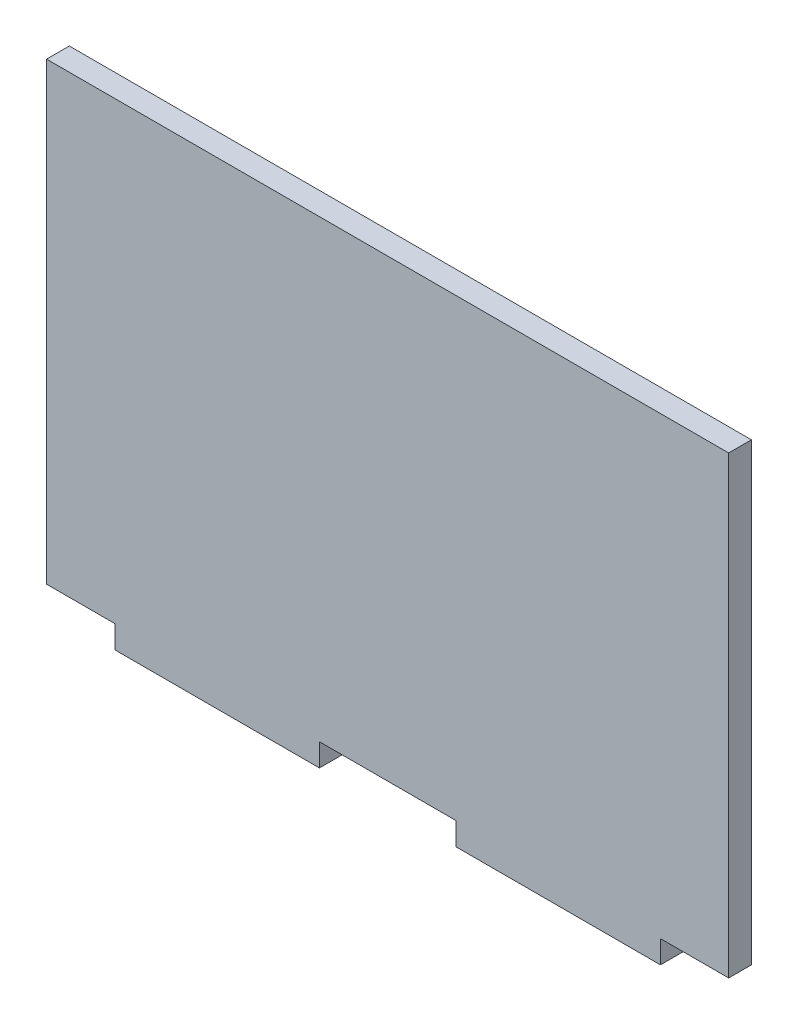
ISO-10303-21;
HEADER;
FILE_DESCRIPTION(('STEP AP214'),'2;1');
FILE_NAME('part.step','',(''),(''),'','','');
FILE_SCHEMA(('AUTOMOTIVE_DESIGN { 1 0 10303 214 1 1 1 1 }'));
ENDSEC;
DATA;
#1=APPLICATION_CONTEXT('core data for automotive mechanical design processes');
#2=APPLICATION_PROTOCOL_DEFINITION('international standard','automotive_design',2000,#1);
#3=PRODUCT_CONTEXT('',#1,'mechanical');
#4=PRODUCT('Part','Part','',(#3));
#5=PRODUCT_RELATED_PRODUCT_CATEGORY('part','',(#4));
#6=PRODUCT_DEFINITION_FORMATION('','',#4);
#7=PRODUCT_DEFINITION_CONTEXT('part definition',#1,'design');
#8=PRODUCT_DEFINITION('design','',#6,#7);
#9=PRODUCT_DEFINITION_SHAPE('','',#8);
#10=(LENGTH_UNIT() NAMED_UNIT(*) SI_UNIT(.MILLI.,.METRE.));
#11=(NAMED_UNIT(*) PLANE_ANGLE_UNIT() SI_UNIT($,.RADIAN.));
#12=(NAMED_UNIT(*) SI_UNIT($,.STERADIAN.) SOLID_ANGLE_UNIT());
#13=UNCERTAINTY_MEASURE_WITH_UNIT(LENGTH_MEASURE(1.E-05),#10,'distance_accuracy_value','');
#14=(GEOMETRIC_REPRESENTATION_CONTEXT(3) GLOBAL_UNCERTAINTY_ASSIGNED_CONTEXT((#13)) GLOBAL_UNIT_ASSIGNED_CONTEXT((#10,
#11,#12)) REPRESENTATION_CONTEXT('',''));
#15=CARTESIAN_POINT('',(0.,0.,0.));
#16=DIRECTION('',(0.,0.,1.));
#17=DIRECTION('',(1.,0.,0.));
#18=AXIS2_PLACEMENT_3D('',#15,#16,#17);
#19=CARTESIAN_POINT('',(0.,0.,5.));
#20=DIRECTION('',(0.,1.,0.));
#21=DIRECTION('',(0.,0.,1.));
#22=AXIS2_PLACEMENT_3D('',#19,#20,#21);
#23=PLANE('',#22);
#24=DIRECTION('',(1.,0.,0.));
#25=VECTOR('',#24,1.);
#26=CARTESIAN_POINT('',(0.,0.,0.));
#27=LINE('',#26,#25);
#28=CARTESIAN_POINT('',(0.,0.,0.));
#29=VERTEX_POINT('',#28);
#30=CARTESIAN_POINT('',(15.,0.,0.));
#31=VERTEX_POINT('',#30);
#32=EDGE_CURVE('E160',#29,#31,#27,.T.);
#33=ORIENTED_EDGE('',*,*,#32,.T.);
#34=DIRECTION('',(0.,0.,-1.));
#35=VECTOR('',#34,1.);
#36=CARTESIAN_POINT('',(15.,0.,5.));
#37=LINE('',#36,#35);
#38=CARTESIAN_POINT('',(15.,0.,5.));
#39=VERTEX_POINT('',#38);
#40=EDGE_CURVE('E43',#39,#31,#37,.T.);
#41=ORIENTED_EDGE('',*,*,#40,.F.);
#42=DIRECTION('',(1.,0.,0.));
#43=VECTOR('',#42,1.);
#44=CARTESIAN_POINT('',(0.,0.,5.));
#45=LINE('',#44,#43);
#46=CARTESIAN_POINT('',(0.,0.,5.));
#47=VERTEX_POINT('',#46);
#48=EDGE_CURVE('E108',#47,#39,#45,.T.);
#49=ORIENTED_EDGE('',*,*,#48,.F.);
#50=DIRECTION('',(0.,0.,-1.));
#51=VECTOR('',#50,1.);
#52=CARTESIAN_POINT('',(0.,0.,5.));
#53=LINE('',#52,#51);
#54=EDGE_CURVE('E11',#47,#29,#53,.T.);
#55=ORIENTED_EDGE('',*,*,#54,.T.);
#56=EDGE_LOOP('',(#33,#41,#49,#55));
#57=FACE_BOUND('',#56,.T.);
#58=ADVANCED_FACE('F35',(#57),#23,.F.);
#59=CARTESIAN_POINT('',(15.,0.,5.));
#60=DIRECTION('',(1.,0.,0.));
#61=DIRECTION('',(0.,1.,0.));
#62=AXIS2_PLACEMENT_3D('',#59,#60,#61);
#63=PLANE('',#62);
#64=DIRECTION('',(0.,-1.,0.));
#65=VECTOR('',#64,1.);
#66=CARTESIAN_POINT('',(15.,0.,0.));
#67=LINE('',#66,#65);
#68=CARTESIAN_POINT('',(15.,-5.,0.));
#69=VERTEX_POINT('',#68);
#70=EDGE_CURVE('E162',#31,#69,#67,.T.);
#71=ORIENTED_EDGE('',*,*,#70,.T.);
#72=DIRECTION('',(0.,0.,-1.));
#73=VECTOR('',#72,1.);
#74=CARTESIAN_POINT('',(15.,-5.,5.));
#75=LINE('',#74,#73);
#76=CARTESIAN_POINT('',(15.,-5.,5.));
#77=VERTEX_POINT('',#76);
#78=EDGE_CURVE('E199',#77,#69,#75,.T.);
#79=ORIENTED_EDGE('',*,*,#78,.F.);
#80=DIRECTION('',(0.,-1.,0.));
#81=VECTOR('',#80,1.);
#82=CARTESIAN_POINT('',(15.,0.,5.));
#83=LINE('',#82,#81);
#84=EDGE_CURVE('E207',#39,#77,#83,.T.);
#85=ORIENTED_EDGE('',*,*,#84,.F.);
#86=ORIENTED_EDGE('',*,*,#40,.T.);
#87=EDGE_LOOP('',(#71,#79,#85,#86));
#88=FACE_BOUND('',#87,.T.);
#89=ADVANCED_FACE('F205',(#88),#63,.F.);
#90=CARTESIAN_POINT('',(15.,-5.,5.));
#91=DIRECTION('',(0.,1.,0.));
#92=DIRECTION('',(-1.,0.,0.));
#93=AXIS2_PLACEMENT_3D('',#90,#91,#92);
#94=PLANE('',#93);
#95=DIRECTION('',(1.,0.,0.));
#96=VECTOR('',#95,1.);
#97=CARTESIAN_POINT('',(15.,-5.,0.));
#98=LINE('',#97,#96);
#99=CARTESIAN_POINT('',(60.,-5.,0.));
#100=VERTEX_POINT('',#99);
#101=EDGE_CURVE('E164',#69,#100,#98,.T.);
#102=ORIENTED_EDGE('',*,*,#101,.T.);
#103=DIRECTION('',(0.,0.,-1.));
#104=VECTOR('',#103,1.);
#105=CARTESIAN_POINT('',(60.,-5.,5.));
#106=LINE('',#105,#104);
#107=CARTESIAN_POINT('',(60.,-5.,5.));
#108=VERTEX_POINT('',#107);
#109=EDGE_CURVE('E196',#108,#100,#106,.T.);
#110=ORIENTED_EDGE('',*,*,#109,.F.);
#111=DIRECTION('',(1.,0.,0.));
#112=VECTOR('',#111,1.);
#113=CARTESIAN_POINT('',(15.,-5.,5.));
#114=LINE('',#113,#112);
#115=EDGE_CURVE('E223',#77,#108,#114,.T.);
#116=ORIENTED_EDGE('',*,*,#115,.F.);
#117=ORIENTED_EDGE('',*,*,#78,.T.);
#118=EDGE_LOOP('',(#102,#110,#116,#117));
#119=FACE_BOUND('',#118,.T.);
#120=ADVANCED_FACE('F214',(#119),#94,.F.);
#121=CARTESIAN_POINT('',(60.,0.,5.));
#122=DIRECTION('',(-1.,0.,0.));
#123=DIRECTION('',(0.,-1.,0.));
#124=AXIS2_PLACEMENT_3D('',#121,#122,#123);
#125=PLANE('',#124);
#126=DIRECTION('',(0.,1.,0.));
#127=VECTOR('',#126,1.);
#128=CARTESIAN_POINT('',(60.,0.,0.));
#129=LINE('',#128,#127);
#130=CARTESIAN_POINT('',(60.,0.,0.));
#131=VERTEX_POINT('',#130);
#132=EDGE_CURVE('E166',#100,#131,#129,.T.);
#133=ORIENTED_EDGE('',*,*,#132,.T.);
#134=DIRECTION('',(0.,0.,-1.));
#135=VECTOR('',#134,1.);
#136=CARTESIAN_POINT('',(60.,0.,5.));
#137=LINE('',#136,#135);
#138=CARTESIAN_POINT('',(60.,0.,5.));
#139=VERTEX_POINT('',#138);
#140=EDGE_CURVE('E193',#139,#131,#137,.T.);
#141=ORIENTED_EDGE('',*,*,#140,.F.);
#142=DIRECTION('',(0.,1.,0.));
#143=VECTOR('',#142,1.);
#144=CARTESIAN_POINT('',(60.,0.,5.));
#145=LINE('',#144,#143);
#146=EDGE_CURVE('E220',#108,#139,#145,.T.);
#147=ORIENTED_EDGE('',*,*,#146,.F.);
#148=ORIENTED_EDGE('',*,*,#109,.T.);
#149=EDGE_LOOP('',(#133,#141,#147,#148));
#150=FACE_BOUND('',#149,.T.);
#151=ADVANCED_FACE('F218',(#150),#125,.F.);
#152=CARTESIAN_POINT('',(60.,0.,5.));
#153=DIRECTION('',(0.,1.,0.));
#154=DIRECTION('',(0.,0.,1.));
#155=AXIS2_PLACEMENT_3D('',#152,#153,#154);
#156=PLANE('',#155);
#157=DIRECTION('',(1.,0.,0.));
#158=VECTOR('',#157,1.);
#159=CARTESIAN_POINT('',(60.,0.,0.));
#160=LINE('',#159,#158);
#161=CARTESIAN_POINT('',(90.,0.,0.));
#162=VERTEX_POINT('',#161);
#163=EDGE_CURVE('E168',#131,#162,#160,.T.);
#164=ORIENTED_EDGE('',*,*,#163,.T.);
#165=DIRECTION('',(0.,0.,-1.));
#166=VECTOR('',#165,1.);
#167=CARTESIAN_POINT('',(90.,0.,5.));
#168=LINE('',#167,#166);
#169=CARTESIAN_POINT('',(90.,0.,5.));
#170=VERTEX_POINT('',#169);
#171=EDGE_CURVE('E190',#170,#162,#168,.T.);
#172=ORIENTED_EDGE('',*,*,#171,.F.);
#173=DIRECTION('',(1.,0.,0.));
#174=VECTOR('',#173,1.);
#175=CARTESIAN_POINT('',(60.,0.,5.));
#176=LINE('',#175,#174);
#177=EDGE_CURVE('E222',#139,#170,#176,.T.);
#178=ORIENTED_EDGE('',*,*,#177,.F.);
#179=ORIENTED_EDGE('',*,*,#140,.T.);
#180=EDGE_LOOP('',(#164,#172,#178,#179));
#181=FACE_BOUND('',#180,.T.);
#182=ADVANCED_FACE('F257',(#181),#156,.F.);
#183=CARTESIAN_POINT('',(90.,0.,5.));
#184=DIRECTION('',(1.,0.,0.));
#185=DIRECTION('',(0.,0.,-1.));
#186=AXIS2_PLACEMENT_3D('',#183,#184,#185);
#187=PLANE('',#186);
#188=DIRECTION('',(0.,-1.,0.));
#189=VECTOR('',#188,1.);
#190=CARTESIAN_POINT('',(90.,0.,0.));
#191=LINE('',#190,#189);
#192=CARTESIAN_POINT('',(90.,-5.,0.));
#193=VERTEX_POINT('',#192);
#194=EDGE_CURVE('E170',#162,#193,#191,.T.);
#195=ORIENTED_EDGE('',*,*,#194,.T.);
#196=DIRECTION('',(0.,0.,-1.));
#197=VECTOR('',#196,1.);
#198=CARTESIAN_POINT('',(90.,-5.,5.));
#199=LINE('',#198,#197);
#200=CARTESIAN_POINT('',(90.,-5.,5.));
#201=VERTEX_POINT('',#200);
#202=EDGE_CURVE('E187',#201,#193,#199,.T.);
#203=ORIENTED_EDGE('',*,*,#202,.F.);
#204=DIRECTION('',(0.,-1.,0.));
#205=VECTOR('',#204,1.);
#206=CARTESIAN_POINT('',(90.,0.,5.));
#207=LINE('',#206,#205);
#208=EDGE_CURVE('E225',#170,#201,#207,.T.);
#209=ORIENTED_EDGE('',*,*,#208,.F.);
#210=ORIENTED_EDGE('',*,*,#171,.T.);
#211=EDGE_LOOP('',(#195,#203,#209,#210));
#212=FACE_BOUND('',#211,.T.);
#213=ADVANCED_FACE('F260',(#212),#187,.F.);
#214=CARTESIAN_POINT('',(135.,-5.,5.));
#215=DIRECTION('',(0.,1.,0.));
#216=DIRECTION('',(-1.,0.,0.));
#217=AXIS2_PLACEMENT_3D('',#214,#215,#216);
#218=PLANE('',#217);
#219=DIRECTION('',(1.,0.,0.));
#220=VECTOR('',#219,1.);
#221=CARTESIAN_POINT('',(135.,-5.,0.));
#222=LINE('',#221,#220);
#223=CARTESIAN_POINT('',(135.,-5.,0.));
#224=VERTEX_POINT('',#223);
#225=EDGE_CURVE('E172',#193,#224,#222,.T.);
#226=ORIENTED_EDGE('',*,*,#225,.T.);
#227=DIRECTION('',(0.,0.,-1.));
#228=VECTOR('',#227,1.);
#229=CARTESIAN_POINT('',(135.,-5.,5.));
#230=LINE('',#229,#228);
#231=CARTESIAN_POINT('',(135.,-5.,5.));
#232=VERTEX_POINT('',#231);
#233=EDGE_CURVE('E184',#232,#224,#230,.T.);
#234=ORIENTED_EDGE('',*,*,#233,.F.);
#235=DIRECTION('',(1.,0.,0.));
#236=VECTOR('',#235,1.);
#237=CARTESIAN_POINT('',(135.,-5.,5.));
#238=LINE('',#237,#236);
#239=EDGE_CURVE('E231',#201,#232,#238,.T.);
#240=ORIENTED_EDGE('',*,*,#239,.F.);
#241=ORIENTED_EDGE('',*,*,#202,.T.);
#242=EDGE_LOOP('',(#226,#234,#240,#241));
#243=FACE_BOUND('',#242,.T.);
#244=ADVANCED_FACE('F237',(#243),#218,.F.);
#245=CARTESIAN_POINT('',(135.,0.,5.));
#246=DIRECTION('',(-1.,0.,0.));
#247=DIRECTION('',(0.,0.,1.));
#248=AXIS2_PLACEMENT_3D('',#245,#246,#247);
#249=PLANE('',#248);
#250=DIRECTION('',(0.,1.,0.));
#251=VECTOR('',#250,1.);
#252=CARTESIAN_POINT('',(135.,0.,0.));
#253=LINE('',#252,#251);
#254=CARTESIAN_POINT('',(135.,0.,0.));
#255=VERTEX_POINT('',#254);
#256=EDGE_CURVE('E174',#224,#255,#253,.T.);
#257=ORIENTED_EDGE('',*,*,#256,.T.);
#258=DIRECTION('',(0.,0.,-1.));
#259=VECTOR('',#258,1.);
#260=CARTESIAN_POINT('',(135.,0.,5.));
#261=LINE('',#260,#259);
#262=CARTESIAN_POINT('',(135.,0.,5.));
#263=VERTEX_POINT('',#262);
#264=EDGE_CURVE('E149',#263,#255,#261,.T.);
#265=ORIENTED_EDGE('',*,*,#264,.F.);
#266=DIRECTION('',(0.,1.,0.));
#267=VECTOR('',#266,1.);
#268=CARTESIAN_POINT('',(135.,0.,5.));
#269=LINE('',#268,#267);
#270=EDGE_CURVE('E140',#232,#263,#269,.T.);
#271=ORIENTED_EDGE('',*,*,#270,.F.);
#272=ORIENTED_EDGE('',*,*,#233,.T.);
#273=EDGE_LOOP('',(#257,#265,#271,#272));
#274=FACE_BOUND('',#273,.T.);
#275=ADVANCED_FACE('F241',(#274),#249,.F.);
#276=CARTESIAN_POINT('',(135.,0.,5.));
#277=DIRECTION('',(0.,1.,0.));
#278=DIRECTION('',(0.,0.,1.));
#279=AXIS2_PLACEMENT_3D('',#276,#277,#278);
#280=PLANE('',#279);
#281=DIRECTION('',(1.,0.,0.));
#282=VECTOR('',#281,1.);
#283=CARTESIAN_POINT('',(135.,0.,0.));
#284=LINE('',#283,#282);
#285=CARTESIAN_POINT('',(150.,0.,0.));
#286=VERTEX_POINT('',#285);
#287=EDGE_CURVE('E148',#255,#286,#284,.T.);
#288=ORIENTED_EDGE('',*,*,#287,.T.);
#289=DIRECTION('',(0.,0.,-1.));
#290=VECTOR('',#289,1.);
#291=CARTESIAN_POINT('',(150.,0.,5.));
#292=LINE('',#291,#290);
#293=CARTESIAN_POINT('',(150.,0.,5.));
#294=VERTEX_POINT('',#293);
#295=EDGE_CURVE('E145',#294,#286,#292,.T.);
#296=ORIENTED_EDGE('',*,*,#295,.F.);
#297=DIRECTION('',(1.,0.,0.));
#298=VECTOR('',#297,1.);
#299=CARTESIAN_POINT('',(135.,0.,5.));
#300=LINE('',#299,#298);
#301=EDGE_CURVE('E134',#263,#294,#300,.T.);
#302=ORIENTED_EDGE('',*,*,#301,.F.);
#303=ORIENTED_EDGE('',*,*,#264,.T.);
#304=EDGE_LOOP('',(#288,#296,#302,#303));
#305=FACE_BOUND('',#304,.T.);
#306=ADVANCED_FACE('F146',(#305),#280,.F.);
#307=CARTESIAN_POINT('',(150.,0.,5.));
#308=DIRECTION('',(-1.,0.,0.));
#309=DIRECTION('',(0.,0.,1.));
#310=AXIS2_PLACEMENT_3D('',#307,#308,#309);
#311=PLANE('',#310);
#312=DIRECTION('',(0.,1.,0.));
#313=VECTOR('',#312,1.);
#314=CARTESIAN_POINT('',(150.,0.,0.));
#315=LINE('',#314,#313);
#316=CARTESIAN_POINT('',(150.,100.,0.));
#317=VERTEX_POINT('',#316);
#318=EDGE_CURVE('E93',#286,#317,#315,.T.);
#319=ORIENTED_EDGE('',*,*,#318,.T.);
#320=DIRECTION('',(0.,0.,-1.));
#321=VECTOR('',#320,1.);
#322=CARTESIAN_POINT('',(150.,100.,5.));
#323=LINE('',#322,#321);
#324=CARTESIAN_POINT('',(150.,100.,5.));
#325=VERTEX_POINT('',#324);
#326=EDGE_CURVE('E150',#325,#317,#323,.T.);
#327=ORIENTED_EDGE('',*,*,#326,.F.);
#328=DIRECTION('',(0.,1.,0.));
#329=VECTOR('',#328,1.);
#330=CARTESIAN_POINT('',(150.,0.,5.));
#331=LINE('',#330,#329);
#332=EDGE_CURVE('E138',#294,#325,#331,.T.);
#333=ORIENTED_EDGE('',*,*,#332,.F.);
#334=ORIENTED_EDGE('',*,*,#295,.T.);
#335=EDGE_LOOP('',(#319,#327,#333,#334));
#336=FACE_BOUND('',#335,.T.);
#337=ADVANCED_FACE('F152',(#336),#311,.F.);
#338=CARTESIAN_POINT('',(0.,100.,5.));
#339=DIRECTION('',(0.,-1.,0.));
#340=DIRECTION('',(0.,0.,-1.));
#341=AXIS2_PLACEMENT_3D('',#338,#339,#340);
#342=PLANE('',#341);
#343=DIRECTION('',(-1.,0.,0.));
#344=VECTOR('',#343,1.);
#345=CARTESIAN_POINT('',(0.,100.,0.));
#346=LINE('',#345,#344);
#347=CARTESIAN_POINT('',(0.,100.,0.));
#348=VERTEX_POINT('',#347);
#349=EDGE_CURVE('E178',#317,#348,#346,.T.);
#350=ORIENTED_EDGE('',*,*,#349,.T.);
#351=DIRECTION('',(0.,0.,-1.));
#352=VECTOR('',#351,1.);
#353=CARTESIAN_POINT('',(0.,100.,5.));
#354=LINE('',#353,#352);
#355=CARTESIAN_POINT('',(0.,100.,5.));
#356=VERTEX_POINT('',#355);
#357=EDGE_CURVE('E156',#356,#348,#354,.T.);
#358=ORIENTED_EDGE('',*,*,#357,.F.);
#359=DIRECTION('',(-1.,0.,0.));
#360=VECTOR('',#359,1.);
#361=CARTESIAN_POINT('',(0.,100.,5.));
#362=LINE('',#361,#360);
#363=EDGE_CURVE('E154',#325,#356,#362,.T.);
#364=ORIENTED_EDGE('',*,*,#363,.F.);
#365=ORIENTED_EDGE('',*,*,#326,.T.);
#366=EDGE_LOOP('',(#350,#358,#364,#365));
#367=FACE_BOUND('',#366,.T.);
#368=ADVANCED_FACE('F244',(#367),#342,.F.);
#369=CARTESIAN_POINT('',(0.,37.5,5.));
#370=DIRECTION('',(1.,0.,0.));
#371=DIRECTION('',(0.,1.,0.));
#372=AXIS2_PLACEMENT_3D('',#369,#370,#371);
#373=PLANE('',#372);
#374=DIRECTION('',(0.,-1.,0.));
#375=VECTOR('',#374,1.);
#376=CARTESIAN_POINT('',(0.,37.5,0.));
#377=LINE('',#376,#375);
#378=EDGE_CURVE('E100',#348,#29,#377,.T.);
#379=ORIENTED_EDGE('',*,*,#378,.T.);
#380=ORIENTED_EDGE('',*,*,#54,.F.);
#381=DIRECTION('',(0.,-1.,0.));
#382=VECTOR('',#381,1.);
#383=CARTESIAN_POINT('',(0.,0.,5.));
#384=LINE('',#383,#382);
#385=EDGE_CURVE('E51',#356,#47,#384,.T.);
#386=ORIENTED_EDGE('',*,*,#385,.F.);
#387=ORIENTED_EDGE('',*,*,#357,.T.);
#388=EDGE_LOOP('',(#379,#380,#386,#387));
#389=FACE_BOUND('',#388,.T.);
#390=ADVANCED_FACE('F245',(#389),#373,.F.);
#391=CARTESIAN_POINT('',(0.,0.,5.));
#392=DIRECTION('',(0.,0.,-1.));
#393=DIRECTION('',(-1.,0.,0.));
#394=AXIS2_PLACEMENT_3D('',#391,#392,#393);
#395=PLANE('',#394);
#396=ORIENTED_EDGE('',*,*,#385,.T.);
#397=ORIENTED_EDGE('',*,*,#48,.T.);
#398=ORIENTED_EDGE('',*,*,#84,.T.);
#399=ORIENTED_EDGE('',*,*,#115,.T.);
#400=ORIENTED_EDGE('',*,*,#146,.T.);
#401=ORIENTED_EDGE('',*,*,#177,.T.);
#402=ORIENTED_EDGE('',*,*,#208,.T.);
#403=ORIENTED_EDGE('',*,*,#239,.T.);
#404=ORIENTED_EDGE('',*,*,#270,.T.);
#405=ORIENTED_EDGE('',*,*,#301,.T.);
#406=ORIENTED_EDGE('',*,*,#332,.T.);
#407=ORIENTED_EDGE('',*,*,#363,.T.);
#408=EDGE_LOOP('',(#396,#397,#398,#399,#400,#401,#402,#403,#404,#405,#406,#407));
#409=FACE_BOUND('',#408,.T.);
#410=ADVANCED_FACE('F136',(#409),#395,.F.);
#411=CARTESIAN_POINT('',(0.,0.,0.));
#412=DIRECTION('',(0.,0.,-1.));
#413=DIRECTION('',(-1.,0.,0.));
#414=AXIS2_PLACEMENT_3D('',#411,#412,#413);
#415=PLANE('',#414);
#416=ORIENTED_EDGE('',*,*,#32,.F.);
#417=ORIENTED_EDGE('',*,*,#378,.F.);
#418=ORIENTED_EDGE('',*,*,#349,.F.);
#419=ORIENTED_EDGE('',*,*,#318,.F.);
#420=ORIENTED_EDGE('',*,*,#287,.F.);
#421=ORIENTED_EDGE('',*,*,#256,.F.);
#422=ORIENTED_EDGE('',*,*,#225,.F.);
#423=ORIENTED_EDGE('',*,*,#194,.F.);
#424=ORIENTED_EDGE('',*,*,#163,.F.);
#425=ORIENTED_EDGE('',*,*,#132,.F.);
#426=ORIENTED_EDGE('',*,*,#101,.F.);
#427=ORIENTED_EDGE('',*,*,#70,.F.);
#428=EDGE_LOOP('',(#416,#417,#418,#419,#420,#421,#422,#423,#424,#425,#426,#427));
#429=FACE_BOUND('',#428,.T.);
#430=ADVANCED_FACE('F209',(#429),#415,.T.);
#431=CLOSED_SHELL('',(#58,#89,#120,#151,#182,#213,#244,#275,#306,#337,#368,#390,#410,#430));
#432=MANIFOLD_SOLID_BREP('B2',#431);
#433=ADVANCED_BREP_SHAPE_REPRESENTATION('',(#18,#432),#14);
#434=SHAPE_DEFINITION_REPRESENTATION(#9,#433);
ENDSEC;
END-ISO-10303-21;
